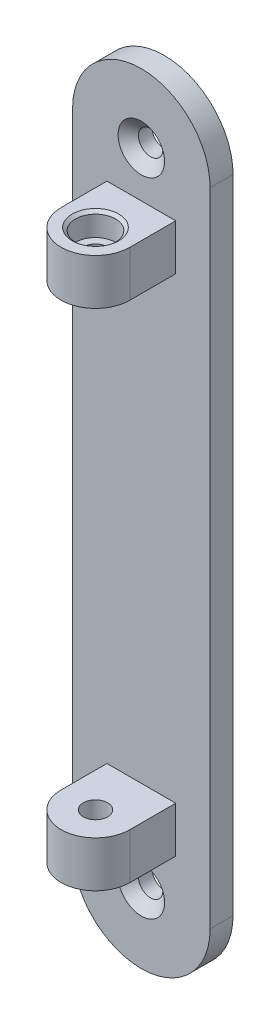
ISO-10303-21;
HEADER;
FILE_DESCRIPTION(('STEP AP214'),'2;1');
FILE_NAME('part.step','',(''),(''),'','','');
FILE_SCHEMA(('AUTOMOTIVE_DESIGN { 1 0 10303 214 1 1 1 1 }'));
ENDSEC;
DATA;
#1=APPLICATION_CONTEXT('core data for automotive mechanical design processes');
#2=APPLICATION_PROTOCOL_DEFINITION('international standard','automotive_design',2000,#1);
#3=PRODUCT_CONTEXT('',#1,'mechanical');
#4=PRODUCT('Part','Part','',(#3));
#5=PRODUCT_RELATED_PRODUCT_CATEGORY('part','',(#4));
#6=PRODUCT_DEFINITION_FORMATION('','',#4);
#7=PRODUCT_DEFINITION_CONTEXT('part definition',#1,'design');
#8=PRODUCT_DEFINITION('design','',#6,#7);
#9=PRODUCT_DEFINITION_SHAPE('','',#8);
#10=(LENGTH_UNIT() NAMED_UNIT(*) SI_UNIT(.MILLI.,.METRE.));
#11=(NAMED_UNIT(*) PLANE_ANGLE_UNIT() SI_UNIT($,.RADIAN.));
#12=(NAMED_UNIT(*) SI_UNIT($,.STERADIAN.) SOLID_ANGLE_UNIT());
#13=UNCERTAINTY_MEASURE_WITH_UNIT(LENGTH_MEASURE(1.E-05),#10,'distance_accuracy_value','');
#14=(GEOMETRIC_REPRESENTATION_CONTEXT(3) GLOBAL_UNCERTAINTY_ASSIGNED_CONTEXT((#13)) GLOBAL_UNIT_ASSIGNED_CONTEXT((#10,
#11,#12)) REPRESENTATION_CONTEXT('',''));
#15=CARTESIAN_POINT('',(0.,0.,0.));
#16=DIRECTION('',(0.,0.,1.));
#17=DIRECTION('',(1.,0.,0.));
#18=AXIS2_PLACEMENT_3D('',#15,#16,#17);
#19=CARTESIAN_POINT('',(9.525,-76.2,19.05));
#20=DIRECTION('',(0.,1.,0.));
#21=DIRECTION('',(0.,0.,1.));
#22=AXIS2_PLACEMENT_3D('',#19,#20,#21);
#23=PLANE('',#22);
#24=DIRECTION('',(1.,0.,0.));
#25=VECTOR('',#24,1.);
#26=CARTESIAN_POINT('',(9.525,-76.2,6.35));
#27=LINE('',#26,#25);
#28=CARTESIAN_POINT('',(9.525,-76.2,6.35));
#29=VERTEX_POINT('',#28);
#30=CARTESIAN_POINT('',(28.575,-76.2,6.35));
#31=VERTEX_POINT('',#30);
#32=EDGE_CURVE('E144',#29,#31,#27,.T.);
#33=ORIENTED_EDGE('',*,*,#32,.T.);
#34=DIRECTION('',(0.,0.,-1.));
#35=VECTOR('',#34,1.);
#36=CARTESIAN_POINT('',(28.575,-76.2,19.05));
#37=LINE('',#36,#35);
#38=CARTESIAN_POINT('',(28.575,-76.2,19.05));
#39=VERTEX_POINT('',#38);
#40=EDGE_CURVE('E56',#39,#31,#37,.T.);
#41=ORIENTED_EDGE('',*,*,#40,.F.);
#42=CARTESIAN_POINT('',(19.05,-76.2,19.05));
#43=DIRECTION('',(0.,-1.,0.));
#44=DIRECTION('',(0.,0.,-1.));
#45=AXIS2_PLACEMENT_3D('',#42,#43,#44);
#46=CIRCLE('',#45,9.525);
#47=CARTESIAN_POINT('',(9.525,-76.2,19.05));
#48=VERTEX_POINT('',#47);
#49=EDGE_CURVE('E131',#39,#48,#46,.T.);
#50=ORIENTED_EDGE('',*,*,#49,.T.);
#51=DIRECTION('',(0.,0.,-1.));
#52=VECTOR('',#51,1.);
#53=CARTESIAN_POINT('',(9.525,-76.2,19.05));
#54=LINE('',#53,#52);
#55=EDGE_CURVE('E147',#48,#29,#54,.T.);
#56=ORIENTED_EDGE('',*,*,#55,.T.);
#57=EDGE_LOOP('',(#33,#41,#50,#56));
#58=FACE_BOUND('',#57,.T.);
#59=CARTESIAN_POINT('',(19.05,-76.2,19.05));
#60=DIRECTION('',(0.,-1.,0.));
#61=DIRECTION('',(0.,0.,-1.));
#62=AXIS2_PLACEMENT_3D('',#59,#60,#61);
#63=CIRCLE('',#62,6.4389);
#64=CARTESIAN_POINT('',(19.05,-76.2,12.6111));
#65=VERTEX_POINT('',#64);
#66=EDGE_CURVE('E625',#65,#65,#63,.T.);
#67=ORIENTED_EDGE('',*,*,#66,.F.);
#68=EDGE_LOOP('',(#67));
#69=FACE_BOUND('',#68,.T.);
#70=ADVANCED_FACE('F39',(#58,#69),#23,.F.);
#71=CARTESIAN_POINT('',(9.525,63.5,19.05));
#72=DIRECTION('',(0.,1.,0.));
#73=DIRECTION('',(0.,0.,1.));
#74=AXIS2_PLACEMENT_3D('',#71,#72,#73);
#75=PLANE('',#74);
#76=DIRECTION('',(1.,0.,0.));
#77=VECTOR('',#76,1.);
#78=CARTESIAN_POINT('',(9.525,63.5,6.35));
#79=LINE('',#78,#77);
#80=CARTESIAN_POINT('',(9.525,63.5,6.35));
#81=VERTEX_POINT('',#80);
#82=CARTESIAN_POINT('',(28.575,63.5,6.35));
#83=VERTEX_POINT('',#82);
#84=EDGE_CURVE('E230',#81,#83,#79,.T.);
#85=ORIENTED_EDGE('',*,*,#84,.T.);
#86=DIRECTION('',(0.,0.,-1.));
#87=VECTOR('',#86,1.);
#88=CARTESIAN_POINT('',(28.575,63.5,19.05));
#89=LINE('',#88,#87);
#90=CARTESIAN_POINT('',(28.575,63.5,19.05));
#91=VERTEX_POINT('',#90);
#92=EDGE_CURVE('E263',#91,#83,#89,.T.);
#93=ORIENTED_EDGE('',*,*,#92,.F.);
#94=CARTESIAN_POINT('',(19.05,63.5,19.05));
#95=DIRECTION('',(0.,1.,0.));
#96=DIRECTION('',(0.,0.,1.));
#97=AXIS2_PLACEMENT_3D('',#94,#95,#96);
#98=CIRCLE('',#97,9.525);
#99=CARTESIAN_POINT('',(9.525,63.5,19.05));
#100=VERTEX_POINT('',#99);
#101=EDGE_CURVE('E226',#100,#91,#98,.T.);
#102=ORIENTED_EDGE('',*,*,#101,.F.);
#103=DIRECTION('',(0.,0.,-1.));
#104=VECTOR('',#103,1.);
#105=CARTESIAN_POINT('',(9.525,63.5,19.05));
#106=LINE('',#105,#104);
#107=EDGE_CURVE('E242',#100,#81,#106,.T.);
#108=ORIENTED_EDGE('',*,*,#107,.T.);
#109=EDGE_LOOP('',(#85,#93,#102,#108));
#110=FACE_BOUND('',#109,.T.);
#111=CARTESIAN_POINT('',(19.05,63.5,19.05));
#112=DIRECTION('',(0.,1.,0.));
#113=DIRECTION('',(0.,0.,1.));
#114=AXIS2_PLACEMENT_3D('',#111,#112,#113);
#115=CIRCLE('',#114,3.3782);
#116=CARTESIAN_POINT('',(19.05,63.5,22.4282));
#117=VERTEX_POINT('',#116);
#118=EDGE_CURVE('E206',#117,#117,#115,.F.);
#119=ORIENTED_EDGE('',*,*,#118,.F.);
#120=EDGE_LOOP('',(#119));
#121=FACE_BOUND('',#120,.T.);
#122=ADVANCED_FACE('F327',(#110,#121),#75,.F.);
#123=CARTESIAN_POINT('',(19.05,88.9,6.35));
#124=DIRECTION('',(0.,0.,1.));
#125=DIRECTION('',(1.,0.,0.));
#126=AXIS2_PLACEMENT_3D('',#123,#124,#125);
#127=PLANE('',#126);
#128=DIRECTION('',(1.,0.,0.));
#129=VECTOR('',#128,1.);
#130=CARTESIAN_POINT('',(9.525,-63.5,6.35));
#131=LINE('',#130,#129);
#132=CARTESIAN_POINT('',(9.525,-63.5,6.35));
#133=VERTEX_POINT('',#132);
#134=CARTESIAN_POINT('',(28.575,-63.5,6.35));
#135=VERTEX_POINT('',#134);
#136=EDGE_CURVE('E160',#133,#135,#131,.T.);
#137=ORIENTED_EDGE('',*,*,#136,.T.);
#138=DIRECTION('',(0.,1.,0.));
#139=VECTOR('',#138,1.);
#140=CARTESIAN_POINT('',(28.575,-76.2,6.35));
#141=LINE('',#140,#139);
#142=EDGE_CURVE('E157',#31,#135,#141,.T.);
#143=ORIENTED_EDGE('',*,*,#142,.F.);
#144=ORIENTED_EDGE('',*,*,#32,.F.);
#145=DIRECTION('',(0.,1.,0.));
#146=VECTOR('',#145,1.);
#147=CARTESIAN_POINT('',(9.525,-76.2,6.35));
#148=LINE('',#147,#146);
#149=EDGE_CURVE('E164',#29,#133,#148,.T.);
#150=ORIENTED_EDGE('',*,*,#149,.T.);
#151=EDGE_LOOP('',(#137,#143,#144,#150));
#152=FACE_BOUND('',#151,.T.);
#153=CARTESIAN_POINT('',(19.05,-88.9,6.35));
#154=DIRECTION('',(0.,0.,1.));
#155=DIRECTION('',(1.,0.,0.));
#156=AXIS2_PLACEMENT_3D('',#153,#154,#155);
#157=CIRCLE('',#156,6.4389);
#158=CARTESIAN_POINT('',(25.4889,-88.9,6.35));
#159=VERTEX_POINT('',#158);
#160=EDGE_CURVE('E177',#159,#159,#157,.T.);
#161=ORIENTED_EDGE('',*,*,#160,.F.);
#162=EDGE_LOOP('',(#161));
#163=FACE_BOUND('',#162,.T.);
#164=CARTESIAN_POINT('',(19.05,88.9,6.35));
#165=DIRECTION('',(0.,0.,1.));
#166=DIRECTION('',(1.,0.,0.));
#167=AXIS2_PLACEMENT_3D('',#164,#165,#166);
#168=CIRCLE('',#167,6.4389);
#169=CARTESIAN_POINT('',(25.4889,88.9,6.35));
#170=VERTEX_POINT('',#169);
#171=EDGE_CURVE('E266',#170,#170,#168,.T.);
#172=ORIENTED_EDGE('',*,*,#171,.F.);
#173=EDGE_LOOP('',(#172));
#174=FACE_BOUND('',#173,.T.);
#175=DIRECTION('',(0.,-1.,0.));
#176=VECTOR('',#175,1.);
#177=CARTESIAN_POINT('',(0.,88.9,6.35));
#178=LINE('',#177,#176);
#179=CARTESIAN_POINT('',(0.,88.9,6.35));
#180=VERTEX_POINT('',#179);
#181=CARTESIAN_POINT('',(0.,-88.9,6.35));
#182=VERTEX_POINT('',#181);
#183=EDGE_CURVE('E279',#180,#182,#178,.T.);
#184=ORIENTED_EDGE('',*,*,#183,.T.);
#185=CARTESIAN_POINT('',(19.05,-88.9,6.35));
#186=DIRECTION('',(0.,0.,-1.));
#187=DIRECTION('',(1.,0.,0.));
#188=AXIS2_PLACEMENT_3D('',#185,#186,#187);
#189=CIRCLE('',#188,19.05);
#190=CARTESIAN_POINT('',(38.1,-88.9,6.35));
#191=VERTEX_POINT('',#190);
#192=EDGE_CURVE('E190',#191,#182,#189,.T.);
#193=ORIENTED_EDGE('',*,*,#192,.F.);
#194=DIRECTION('',(0.,1.,0.));
#195=VECTOR('',#194,1.);
#196=CARTESIAN_POINT('',(38.1,0.,6.35));
#197=LINE('',#196,#195);
#198=CARTESIAN_POINT('',(38.1,88.9,6.35));
#199=VERTEX_POINT('',#198);
#200=EDGE_CURVE('E282',#191,#199,#197,.T.);
#201=ORIENTED_EDGE('',*,*,#200,.T.);
#202=CARTESIAN_POINT('',(19.05,88.9,6.35));
#203=DIRECTION('',(0.,0.,1.));
#204=DIRECTION('',(1.,0.,0.));
#205=AXIS2_PLACEMENT_3D('',#202,#203,#204);
#206=CIRCLE('',#205,19.05);
#207=EDGE_CURVE('E286',#199,#180,#206,.T.);
#208=ORIENTED_EDGE('',*,*,#207,.T.);
#209=EDGE_LOOP('',(#184,#193,#201,#208));
#210=FACE_BOUND('',#209,.T.);
#211=DIRECTION('',(0.,-1.,0.));
#212=VECTOR('',#211,1.);
#213=CARTESIAN_POINT('',(28.575,76.2,6.35));
#214=LINE('',#213,#212);
#215=CARTESIAN_POINT('',(28.575,76.2,6.35));
#216=VERTEX_POINT('',#215);
#217=EDGE_CURVE('E246',#216,#83,#214,.T.);
#218=ORIENTED_EDGE('',*,*,#217,.T.);
#219=ORIENTED_EDGE('',*,*,#84,.F.);
#220=DIRECTION('',(0.,-1.,0.));
#221=VECTOR('',#220,1.);
#222=CARTESIAN_POINT('',(9.525,76.2,6.35));
#223=LINE('',#222,#221);
#224=CARTESIAN_POINT('',(9.525,76.2,6.35));
#225=VERTEX_POINT('',#224);
#226=EDGE_CURVE('E238',#225,#81,#223,.T.);
#227=ORIENTED_EDGE('',*,*,#226,.F.);
#228=DIRECTION('',(1.,0.,0.));
#229=VECTOR('',#228,1.);
#230=CARTESIAN_POINT('',(9.525,76.2,6.35));
#231=LINE('',#230,#229);
#232=EDGE_CURVE('E64',#225,#216,#231,.T.);
#233=ORIENTED_EDGE('',*,*,#232,.T.);
#234=EDGE_LOOP('',(#218,#219,#227,#233));
#235=FACE_BOUND('',#234,.T.);
#236=ADVANCED_FACE('F314',(#152,#163,#174,#210,#235),#127,.T.);
#237=CARTESIAN_POINT('',(0.,88.9,6.35));
#238=DIRECTION('',(1.,0.,0.));
#239=DIRECTION('',(0.,0.,-1.));
#240=AXIS2_PLACEMENT_3D('',#237,#238,#239);
#241=PLANE('',#240);
#242=DIRECTION('',(0.,-1.,0.));
#243=VECTOR('',#242,1.);
#244=CARTESIAN_POINT('',(0.,88.9,0.));
#245=LINE('',#244,#243);
#246=CARTESIAN_POINT('',(0.,88.9,0.));
#247=VERTEX_POINT('',#246);
#248=CARTESIAN_POINT('',(0.,-88.9,0.));
#249=VERTEX_POINT('',#248);
#250=EDGE_CURVE('E278',#247,#249,#245,.T.);
#251=ORIENTED_EDGE('',*,*,#250,.T.);
#252=DIRECTION('',(0.,0.,-1.));
#253=VECTOR('',#252,1.);
#254=CARTESIAN_POINT('',(0.,-88.9,6.35));
#255=LINE('',#254,#253);
#256=EDGE_CURVE('E201',#182,#249,#255,.T.);
#257=ORIENTED_EDGE('',*,*,#256,.F.);
#258=ORIENTED_EDGE('',*,*,#183,.F.);
#259=DIRECTION('',(0.,0.,-1.));
#260=VECTOR('',#259,1.);
#261=CARTESIAN_POINT('',(0.,88.9,6.35));
#262=LINE('',#261,#260);
#263=EDGE_CURVE('E49',#180,#247,#262,.T.);
#264=ORIENTED_EDGE('',*,*,#263,.T.);
#265=EDGE_LOOP('',(#251,#257,#258,#264));
#266=FACE_BOUND('',#265,.T.);
#267=ADVANCED_FACE('F41',(#266),#241,.F.);
#268=CARTESIAN_POINT('',(38.1,0.,6.35));
#269=DIRECTION('',(-1.,0.,0.));
#270=DIRECTION('',(0.,0.,1.));
#271=AXIS2_PLACEMENT_3D('',#268,#269,#270);
#272=PLANE('',#271);
#273=DIRECTION('',(0.,1.,0.));
#274=VECTOR('',#273,1.);
#275=CARTESIAN_POINT('',(38.1,0.,0.));
#276=LINE('',#275,#274);
#277=CARTESIAN_POINT('',(38.1,-88.9,0.));
#278=VERTEX_POINT('',#277);
#279=CARTESIAN_POINT('',(38.1,88.9,0.));
#280=VERTEX_POINT('',#279);
#281=EDGE_CURVE('E291',#278,#280,#276,.T.);
#282=ORIENTED_EDGE('',*,*,#281,.T.);
#283=DIRECTION('',(0.,0.,-1.));
#284=VECTOR('',#283,1.);
#285=CARTESIAN_POINT('',(38.1,88.9,6.35));
#286=LINE('',#285,#284);
#287=EDGE_CURVE('E11',#199,#280,#286,.T.);
#288=ORIENTED_EDGE('',*,*,#287,.F.);
#289=ORIENTED_EDGE('',*,*,#200,.F.);
#290=DIRECTION('',(0.,0.,-1.));
#291=VECTOR('',#290,1.);
#292=CARTESIAN_POINT('',(38.1,-88.9,6.35));
#293=LINE('',#292,#291);
#294=EDGE_CURVE('E194',#191,#278,#293,.T.);
#295=ORIENTED_EDGE('',*,*,#294,.T.);
#296=EDGE_LOOP('',(#282,#288,#289,#295));
#297=FACE_BOUND('',#296,.T.);
#298=ADVANCED_FACE('F319',(#297),#272,.F.);
#299=CARTESIAN_POINT('',(19.05,88.9,6.35));
#300=DIRECTION('',(0.,0.,-1.));
#301=DIRECTION('',(-1.,0.,0.));
#302=AXIS2_PLACEMENT_3D('',#299,#300,#301);
#303=CYLINDRICAL_SURFACE('',#302,19.05);
#304=CARTESIAN_POINT('',(19.05,88.9,0.));
#305=DIRECTION('',(0.,0.,1.));
#306=DIRECTION('',(1.,0.,0.));
#307=AXIS2_PLACEMENT_3D('',#304,#305,#306);
#308=CIRCLE('',#307,19.05);
#309=EDGE_CURVE('E283',#280,#247,#308,.T.);
#310=ORIENTED_EDGE('',*,*,#309,.T.);
#311=ORIENTED_EDGE('',*,*,#263,.F.);
#312=ORIENTED_EDGE('',*,*,#207,.F.);
#313=ORIENTED_EDGE('',*,*,#287,.T.);
#314=EDGE_LOOP('',(#310,#311,#312,#313));
#315=FACE_BOUND('',#314,.T.);
#316=ADVANCED_FACE('F317',(#315),#303,.T.);
#317=CARTESIAN_POINT('',(19.05,88.9,0.));
#318=DIRECTION('',(0.,0.,1.));
#319=DIRECTION('',(1.,0.,0.));
#320=AXIS2_PLACEMENT_3D('',#317,#318,#319);
#321=PLANE('',#320);
#322=CARTESIAN_POINT('',(19.05,-88.9,0.));
#323=DIRECTION('',(0.,0.,1.));
#324=DIRECTION('',(1.,0.,0.));
#325=AXIS2_PLACEMENT_3D('',#322,#323,#324);
#326=CIRCLE('',#325,3.3782);
#327=CARTESIAN_POINT('',(22.4282,-88.9,0.));
#328=VERTEX_POINT('',#327);
#329=EDGE_CURVE('E185',#328,#328,#326,.T.);
#330=ORIENTED_EDGE('',*,*,#329,.T.);
#331=EDGE_LOOP('',(#330));
#332=FACE_BOUND('',#331,.T.);
#333=CARTESIAN_POINT('',(19.05,88.9,0.));
#334=DIRECTION('',(0.,0.,1.));
#335=DIRECTION('',(1.,0.,0.));
#336=AXIS2_PLACEMENT_3D('',#333,#334,#335);
#337=CIRCLE('',#336,3.3782);
#338=CARTESIAN_POINT('',(22.4282,88.9,0.));
#339=VERTEX_POINT('',#338);
#340=EDGE_CURVE('E274',#339,#339,#337,.T.);
#341=ORIENTED_EDGE('',*,*,#340,.T.);
#342=EDGE_LOOP('',(#341));
#343=FACE_BOUND('',#342,.T.);
#344=ORIENTED_EDGE('',*,*,#250,.F.);
#345=ORIENTED_EDGE('',*,*,#309,.F.);
#346=ORIENTED_EDGE('',*,*,#281,.F.);
#347=CARTESIAN_POINT('',(19.05,-88.9,0.));
#348=DIRECTION('',(0.,0.,-1.));
#349=DIRECTION('',(1.,0.,0.));
#350=AXIS2_PLACEMENT_3D('',#347,#348,#349);
#351=CIRCLE('',#350,19.05);
#352=EDGE_CURVE('E189',#278,#249,#351,.T.);
#353=ORIENTED_EDGE('',*,*,#352,.T.);
#354=EDGE_LOOP('',(#344,#345,#346,#353));
#355=FACE_BOUND('',#354,.T.);
#356=ADVANCED_FACE('F307',(#332,#343,#355),#321,.F.);
#357=CARTESIAN_POINT('',(19.05,88.9,6.35));
#358=DIRECTION('',(0.,0.,1.));
#359=DIRECTION('',(1.,0.,0.));
#360=AXIS2_PLACEMENT_3D('',#357,#358,#359);
#361=CYLINDRICAL_SURFACE('',#360,3.3782);
#362=ORIENTED_EDGE('',*,*,#340,.F.);
#363=EDGE_LOOP('',(#362));
#364=FACE_BOUND('',#363,.T.);
#365=CARTESIAN_POINT('',(19.05,88.9,3.7817677588557));
#366=DIRECTION('',(0.,0.,1.));
#367=DIRECTION('',(1.,0.,0.));
#368=AXIS2_PLACEMENT_3D('',#365,#366,#367);
#369=CIRCLE('',#368,3.3782);
#370=CARTESIAN_POINT('',(22.4282,88.9,3.7817677588557));
#371=VERTEX_POINT('',#370);
#372=EDGE_CURVE('E270',#371,#371,#369,.T.);
#373=ORIENTED_EDGE('',*,*,#372,.T.);
#374=EDGE_LOOP('',(#373));
#375=FACE_BOUND('',#374,.T.);
#376=ADVANCED_FACE('F390',(#364,#375),#361,.F.);
#377=CARTESIAN_POINT('',(19.05,88.9,6.35));
#378=DIRECTION('',(0.,0.,1.));
#379=DIRECTION('',(1.,0.,0.));
#380=AXIS2_PLACEMENT_3D('',#377,#378,#379);
#381=CONICAL_SURFACE('',#380,6.4389,0.872664625997165);
#382=ORIENTED_EDGE('',*,*,#372,.F.);
#383=EDGE_LOOP('',(#382));
#384=FACE_BOUND('',#383,.T.);
#385=ORIENTED_EDGE('',*,*,#171,.T.);
#386=EDGE_LOOP('',(#385));
#387=FACE_BOUND('',#386,.T.);
#388=ADVANCED_FACE('F385',(#384,#387),#381,.F.);
#389=CARTESIAN_POINT('',(28.575,76.2,19.05));
#390=DIRECTION('',(1.,0.,0.));
#391=DIRECTION('',(0.,1.,0.));
#392=AXIS2_PLACEMENT_3D('',#389,#390,#391);
#393=PLANE('',#392);
#394=ORIENTED_EDGE('',*,*,#217,.F.);
#395=DIRECTION('',(0.,0.,-1.));
#396=VECTOR('',#395,1.);
#397=CARTESIAN_POINT('',(28.575,76.2,19.05));
#398=LINE('',#397,#396);
#399=CARTESIAN_POINT('',(28.575,76.2,19.05));
#400=VERTEX_POINT('',#399);
#401=EDGE_CURVE('E260',#400,#216,#398,.T.);
#402=ORIENTED_EDGE('',*,*,#401,.F.);
#403=DIRECTION('',(0.,-1.,0.));
#404=VECTOR('',#403,1.);
#405=CARTESIAN_POINT('',(28.575,76.2,19.05));
#406=LINE('',#405,#404);
#407=EDGE_CURVE('E234',#400,#91,#406,.T.);
#408=ORIENTED_EDGE('',*,*,#407,.T.);
#409=ORIENTED_EDGE('',*,*,#92,.T.);
#410=EDGE_LOOP('',(#394,#402,#408,#409));
#411=FACE_BOUND('',#410,.T.);
#412=ADVANCED_FACE('F382',(#411),#393,.T.);
#413=CARTESIAN_POINT('',(9.525,76.2,19.05));
#414=DIRECTION('',(0.,1.,0.));
#415=DIRECTION('',(0.,0.,1.));
#416=AXIS2_PLACEMENT_3D('',#413,#414,#415);
#417=PLANE('',#416);
#418=CARTESIAN_POINT('',(19.05,76.2,19.05));
#419=DIRECTION('',(0.,1.,0.));
#420=DIRECTION('',(0.,0.,1.));
#421=AXIS2_PLACEMENT_3D('',#418,#419,#420);
#422=CIRCLE('',#421,6.4389);
#423=CARTESIAN_POINT('',(19.05,76.2,25.4889));
#424=VERTEX_POINT('',#423);
#425=EDGE_CURVE('E205',#424,#424,#422,.T.);
#426=ORIENTED_EDGE('',*,*,#425,.F.);
#427=EDGE_LOOP('',(#426));
#428=FACE_BOUND('',#427,.T.);
#429=ORIENTED_EDGE('',*,*,#232,.F.);
#430=DIRECTION('',(0.,0.,-1.));
#431=VECTOR('',#430,1.);
#432=CARTESIAN_POINT('',(9.525,76.2,19.05));
#433=LINE('',#432,#431);
#434=CARTESIAN_POINT('',(9.525,76.2,19.05));
#435=VERTEX_POINT('',#434);
#436=EDGE_CURVE('E257',#435,#225,#433,.T.);
#437=ORIENTED_EDGE('',*,*,#436,.F.);
#438=CARTESIAN_POINT('',(19.05,76.2,19.05));
#439=DIRECTION('',(0.,-1.,0.));
#440=DIRECTION('',(0.,0.,-1.));
#441=AXIS2_PLACEMENT_3D('',#438,#439,#440);
#442=CIRCLE('',#441,9.525);
#443=EDGE_CURVE('E210',#400,#435,#442,.T.);
#444=ORIENTED_EDGE('',*,*,#443,.F.);
#445=ORIENTED_EDGE('',*,*,#401,.T.);
#446=EDGE_LOOP('',(#429,#437,#444,#445));
#447=FACE_BOUND('',#446,.T.);
#448=ADVANCED_FACE('F378',(#428,#447),#417,.T.);
#449=CARTESIAN_POINT('',(9.525,76.2,19.05));
#450=DIRECTION('',(1.,0.,0.));
#451=DIRECTION('',(0.,1.,0.));
#452=AXIS2_PLACEMENT_3D('',#449,#450,#451);
#453=PLANE('',#452);
#454=ORIENTED_EDGE('',*,*,#226,.T.);
#455=ORIENTED_EDGE('',*,*,#107,.F.);
#456=DIRECTION('',(0.,-1.,0.));
#457=VECTOR('',#456,1.);
#458=CARTESIAN_POINT('',(9.525,76.2,19.05));
#459=LINE('',#458,#457);
#460=EDGE_CURVE('E237',#435,#100,#459,.T.);
#461=ORIENTED_EDGE('',*,*,#460,.F.);
#462=ORIENTED_EDGE('',*,*,#436,.T.);
#463=EDGE_LOOP('',(#454,#455,#461,#462));
#464=FACE_BOUND('',#463,.T.);
#465=ADVANCED_FACE('F374',(#464),#453,.F.);
#466=CARTESIAN_POINT('',(19.05,42.2014525143145,19.05));
#467=DIRECTION('',(0.,1.,0.));
#468=DIRECTION('',(0.,0.,1.));
#469=AXIS2_PLACEMENT_3D('',#466,#467,#468);
#470=CYLINDRICAL_SURFACE('',#469,9.525);
#471=ORIENTED_EDGE('',*,*,#460,.T.);
#472=ORIENTED_EDGE('',*,*,#101,.T.);
#473=ORIENTED_EDGE('',*,*,#407,.F.);
#474=ORIENTED_EDGE('',*,*,#443,.T.);
#475=EDGE_LOOP('',(#471,#472,#473,#474));
#476=FACE_BOUND('',#475,.T.);
#477=ADVANCED_FACE('F370',(#476),#470,.T.);
#478=CARTESIAN_POINT('',(19.05,76.2,19.05));
#479=DIRECTION('',(0.,1.,0.));
#480=DIRECTION('',(0.,0.,1.));
#481=AXIS2_PLACEMENT_3D('',#478,#479,#480);
#482=CYLINDRICAL_SURFACE('',#481,3.3782);
#483=ORIENTED_EDGE('',*,*,#118,.T.);
#484=EDGE_LOOP('',(#483));
#485=FACE_BOUND('',#484,.T.);
#486=CARTESIAN_POINT('',(19.05,69.85,19.05));
#487=DIRECTION('',(0.,1.,0.));
#488=DIRECTION('',(0.,0.,1.));
#489=AXIS2_PLACEMENT_3D('',#486,#487,#488);
#490=CIRCLE('',#489,3.3782);
#491=CARTESIAN_POINT('',(19.05,69.85,22.4282));
#492=VERTEX_POINT('',#491);
#493=EDGE_CURVE('E211',#492,#492,#490,.T.);
#494=ORIENTED_EDGE('',*,*,#493,.T.);
#495=EDGE_LOOP('',(#494));
#496=FACE_BOUND('',#495,.T.);
#497=ADVANCED_FACE('F366',(#485,#496),#482,.F.);
#498=CARTESIAN_POINT('',(22.4282,69.85,19.05));
#499=DIRECTION('',(0.,-1.,0.));
#500=DIRECTION('',(0.,0.,-1.));
#501=AXIS2_PLACEMENT_3D('',#498,#499,#500);
#502=PLANE('',#501);
#503=ORIENTED_EDGE('',*,*,#493,.F.);
#504=EDGE_LOOP('',(#503));
#505=FACE_BOUND('',#504,.T.);
#506=CARTESIAN_POINT('',(19.05,69.85,19.05));
#507=DIRECTION('',(0.,1.,0.));
#508=DIRECTION('',(0.,0.,1.));
#509=AXIS2_PLACEMENT_3D('',#506,#507,#508);
#510=CIRCLE('',#509,5.55625);
#511=CARTESIAN_POINT('',(19.05,69.85,24.60625));
#512=VERTEX_POINT('',#511);
#513=EDGE_CURVE('E219',#512,#512,#510,.T.);
#514=ORIENTED_EDGE('',*,*,#513,.T.);
#515=EDGE_LOOP('',(#514));
#516=FACE_BOUND('',#515,.T.);
#517=ADVANCED_FACE('F362',(#505,#516),#502,.F.);
#518=CARTESIAN_POINT('',(19.05,76.2,19.05));
#519=DIRECTION('',(0.,1.,0.));
#520=DIRECTION('',(0.,0.,1.));
#521=AXIS2_PLACEMENT_3D('',#518,#519,#520);
#522=CYLINDRICAL_SURFACE('',#521,5.55625);
#523=ORIENTED_EDGE('',*,*,#513,.F.);
#524=EDGE_LOOP('',(#523));
#525=FACE_BOUND('',#524,.T.);
#526=CARTESIAN_POINT('',(19.05,75.4593687105414,19.05));
#527=DIRECTION('',(0.,1.,0.));
#528=DIRECTION('',(0.,0.,1.));
#529=AXIS2_PLACEMENT_3D('',#526,#527,#528);
#530=CIRCLE('',#529,5.55625);
#531=CARTESIAN_POINT('',(19.05,75.4593687105414,24.60625));
#532=VERTEX_POINT('',#531);
#533=EDGE_CURVE('E215',#532,#532,#530,.T.);
#534=ORIENTED_EDGE('',*,*,#533,.T.);
#535=EDGE_LOOP('',(#534));
#536=FACE_BOUND('',#535,.T.);
#537=ADVANCED_FACE('F358',(#525,#536),#522,.F.);
#538=CARTESIAN_POINT('',(19.05,76.2,19.05));
#539=DIRECTION('',(0.,1.,0.));
#540=DIRECTION('',(0.,0.,1.));
#541=AXIS2_PLACEMENT_3D('',#538,#539,#540);
#542=CONICAL_SURFACE('',#541,6.4389,0.872664625997164);
#543=ORIENTED_EDGE('',*,*,#533,.F.);
#544=EDGE_LOOP('',(#543));
#545=FACE_BOUND('',#544,.T.);
#546=ORIENTED_EDGE('',*,*,#425,.T.);
#547=EDGE_LOOP('',(#546));
#548=FACE_BOUND('',#547,.T.);
#549=ADVANCED_FACE('F355',(#545,#548),#542,.F.);
#550=CARTESIAN_POINT('',(19.05,-88.9,6.35));
#551=DIRECTION('',(0.,0.,-1.));
#552=DIRECTION('',(-1.,0.,0.));
#553=AXIS2_PLACEMENT_3D('',#550,#551,#552);
#554=CYLINDRICAL_SURFACE('',#553,19.05);
#555=ORIENTED_EDGE('',*,*,#352,.F.);
#556=ORIENTED_EDGE('',*,*,#294,.F.);
#557=ORIENTED_EDGE('',*,*,#192,.T.);
#558=ORIENTED_EDGE('',*,*,#256,.T.);
#559=EDGE_LOOP('',(#555,#556,#557,#558));
#560=FACE_BOUND('',#559,.T.);
#561=ADVANCED_FACE('F311',(#560),#554,.T.);
#562=CARTESIAN_POINT('',(19.05,-88.9,6.35));
#563=DIRECTION('',(0.,0.,1.));
#564=DIRECTION('',(1.,0.,0.));
#565=AXIS2_PLACEMENT_3D('',#562,#563,#564);
#566=CYLINDRICAL_SURFACE('',#565,3.3782);
#567=ORIENTED_EDGE('',*,*,#329,.F.);
#568=EDGE_LOOP('',(#567));
#569=FACE_BOUND('',#568,.T.);
#570=CARTESIAN_POINT('',(19.05,-88.9,3.7817677588557));
#571=DIRECTION('',(0.,0.,1.));
#572=DIRECTION('',(1.,0.,0.));
#573=AXIS2_PLACEMENT_3D('',#570,#571,#572);
#574=CIRCLE('',#573,3.3782);
#575=CARTESIAN_POINT('',(22.4282,-88.9,3.7817677588557));
#576=VERTEX_POINT('',#575);
#577=EDGE_CURVE('E181',#576,#576,#574,.T.);
#578=ORIENTED_EDGE('',*,*,#577,.T.);
#579=EDGE_LOOP('',(#578));
#580=FACE_BOUND('',#579,.T.);
#581=ADVANCED_FACE('F348',(#569,#580),#566,.F.);
#582=CARTESIAN_POINT('',(19.05,-88.9,6.35));
#583=DIRECTION('',(0.,0.,1.));
#584=DIRECTION('',(1.,0.,0.));
#585=AXIS2_PLACEMENT_3D('',#582,#583,#584);
#586=CONICAL_SURFACE('',#585,6.4389,0.872664625997165);
#587=ORIENTED_EDGE('',*,*,#577,.F.);
#588=EDGE_LOOP('',(#587));
#589=FACE_BOUND('',#588,.T.);
#590=ORIENTED_EDGE('',*,*,#160,.T.);
#591=EDGE_LOOP('',(#590));
#592=FACE_BOUND('',#591,.T.);
#593=ADVANCED_FACE('F344',(#589,#592),#586,.F.);
#594=CARTESIAN_POINT('',(9.525,-63.5,19.05));
#595=DIRECTION('',(0.,1.,0.));
#596=DIRECTION('',(0.,0.,1.));
#597=AXIS2_PLACEMENT_3D('',#594,#595,#596);
#598=PLANE('',#597);
#599=CARTESIAN_POINT('',(19.05,-63.5,19.05));
#600=DIRECTION('',(0.,1.,0.));
#601=DIRECTION('',(0.,0.,1.));
#602=AXIS2_PLACEMENT_3D('',#599,#600,#601);
#603=CIRCLE('',#602,3.37819999999998);
#604=CARTESIAN_POINT('',(19.05,-63.5,22.4282));
#605=VERTEX_POINT('',#604);
#606=EDGE_CURVE('E43',#605,#605,#603,.T.);
#607=ORIENTED_EDGE('',*,*,#606,.F.);
#608=EDGE_LOOP('',(#607));
#609=FACE_BOUND('',#608,.T.);
#610=ORIENTED_EDGE('',*,*,#136,.F.);
#611=DIRECTION('',(0.,0.,-1.));
#612=VECTOR('',#611,1.);
#613=CARTESIAN_POINT('',(9.525,-63.5,19.05));
#614=LINE('',#613,#612);
#615=CARTESIAN_POINT('',(9.525,-63.5,19.05));
#616=VERTEX_POINT('',#615);
#617=EDGE_CURVE('E174',#616,#133,#614,.T.);
#618=ORIENTED_EDGE('',*,*,#617,.F.);
#619=CARTESIAN_POINT('',(19.05,-63.5,19.05));
#620=DIRECTION('',(0.,-1.,0.));
#621=DIRECTION('',(0.,0.,-1.));
#622=AXIS2_PLACEMENT_3D('',#619,#620,#621);
#623=CIRCLE('',#622,9.525);
#624=CARTESIAN_POINT('',(28.575,-63.5,19.05));
#625=VERTEX_POINT('',#624);
#626=EDGE_CURVE('E140',#616,#625,#623,.F.);
#627=ORIENTED_EDGE('',*,*,#626,.T.);
#628=DIRECTION('',(0.,0.,-1.));
#629=VECTOR('',#628,1.);
#630=CARTESIAN_POINT('',(28.575,-63.5,19.05));
#631=LINE('',#630,#629);
#632=EDGE_CURVE('E148',#625,#135,#631,.T.);
#633=ORIENTED_EDGE('',*,*,#632,.T.);
#634=EDGE_LOOP('',(#610,#618,#627,#633));
#635=FACE_BOUND('',#634,.T.);
#636=ADVANCED_FACE('F340',(#609,#635),#598,.T.);
#637=CARTESIAN_POINT('',(9.525,-76.2,19.05));
#638=DIRECTION('',(-1.,0.,0.));
#639=DIRECTION('',(0.,-1.,0.));
#640=AXIS2_PLACEMENT_3D('',#637,#638,#639);
#641=PLANE('',#640);
#642=ORIENTED_EDGE('',*,*,#149,.F.);
#643=ORIENTED_EDGE('',*,*,#55,.F.);
#644=DIRECTION('',(0.,1.,0.));
#645=VECTOR('',#644,1.);
#646=CARTESIAN_POINT('',(9.525,-76.2,19.05));
#647=LINE('',#646,#645);
#648=EDGE_CURVE('E136',#48,#616,#647,.T.);
#649=ORIENTED_EDGE('',*,*,#648,.T.);
#650=ORIENTED_EDGE('',*,*,#617,.T.);
#651=EDGE_LOOP('',(#642,#643,#649,#650));
#652=FACE_BOUND('',#651,.T.);
#653=ADVANCED_FACE('F337',(#652),#641,.T.);
#654=CARTESIAN_POINT('',(28.575,-76.2,19.05));
#655=DIRECTION('',(-1.,0.,0.));
#656=DIRECTION('',(0.,-1.,0.));
#657=AXIS2_PLACEMENT_3D('',#654,#655,#656);
#658=PLANE('',#657);
#659=ORIENTED_EDGE('',*,*,#142,.T.);
#660=ORIENTED_EDGE('',*,*,#632,.F.);
#661=DIRECTION('',(0.,1.,0.));
#662=VECTOR('',#661,1.);
#663=CARTESIAN_POINT('',(28.575,-76.2,19.05));
#664=LINE('',#663,#662);
#665=EDGE_CURVE('E133',#39,#625,#664,.T.);
#666=ORIENTED_EDGE('',*,*,#665,.F.);
#667=ORIENTED_EDGE('',*,*,#40,.T.);
#668=EDGE_LOOP('',(#659,#660,#666,#667));
#669=FACE_BOUND('',#668,.T.);
#670=ADVANCED_FACE('F151',(#669),#658,.F.);
#671=CARTESIAN_POINT('',(19.05,84.7985474856855,19.05));
#672=DIRECTION('',(0.,-1.,0.));
#673=DIRECTION('',(0.,0.,-1.));
#674=AXIS2_PLACEMENT_3D('',#671,#672,#673);
#675=CYLINDRICAL_SURFACE('',#674,9.525);
#676=ORIENTED_EDGE('',*,*,#626,.F.);
#677=ORIENTED_EDGE('',*,*,#648,.F.);
#678=ORIENTED_EDGE('',*,*,#49,.F.);
#679=ORIENTED_EDGE('',*,*,#665,.T.);
#680=EDGE_LOOP('',(#676,#677,#678,#679));
#681=FACE_BOUND('',#680,.T.);
#682=ADVANCED_FACE('F132',(#681),#675,.T.);
#683=CARTESIAN_POINT('',(19.05,-76.2,19.05));
#684=DIRECTION('',(0.,-1.,0.));
#685=DIRECTION('',(0.,0.,-1.));
#686=AXIS2_PLACEMENT_3D('',#683,#684,#685);
#687=CYLINDRICAL_SURFACE('',#686,3.37819999999998);
#688=ORIENTED_EDGE('',*,*,#606,.T.);
#689=EDGE_LOOP('',(#688));
#690=FACE_BOUND('',#689,.T.);
#691=CARTESIAN_POINT('',(19.05,-69.85,19.05));
#692=DIRECTION('',(0.,-1.,0.));
#693=DIRECTION('',(0.,0.,-1.));
#694=AXIS2_PLACEMENT_3D('',#691,#692,#693);
#695=CIRCLE('',#694,3.3782);
#696=CARTESIAN_POINT('',(19.05,-69.85,15.6718));
#697=VERTEX_POINT('',#696);
#698=EDGE_CURVE('E627',#697,#697,#695,.T.);
#699=ORIENTED_EDGE('',*,*,#698,.T.);
#700=EDGE_LOOP('',(#699));
#701=FACE_BOUND('',#700,.T.);
#702=ADVANCED_FACE('F489',(#690,#701),#687,.F.);
#703=CARTESIAN_POINT('',(22.4282,-69.85,19.05));
#704=DIRECTION('',(0.,1.,0.));
#705=DIRECTION('',(0.,0.,1.));
#706=AXIS2_PLACEMENT_3D('',#703,#704,#705);
#707=PLANE('',#706);
#708=ORIENTED_EDGE('',*,*,#698,.F.);
#709=EDGE_LOOP('',(#708));
#710=FACE_BOUND('',#709,.T.);
#711=CARTESIAN_POINT('',(19.05,-69.85,19.05));
#712=DIRECTION('',(0.,-1.,0.));
#713=DIRECTION('',(0.,0.,-1.));
#714=AXIS2_PLACEMENT_3D('',#711,#712,#713);
#715=CIRCLE('',#714,5.55625);
#716=CARTESIAN_POINT('',(19.05,-69.85,13.49375));
#717=VERTEX_POINT('',#716);
#718=EDGE_CURVE('E631',#717,#717,#715,.T.);
#719=ORIENTED_EDGE('',*,*,#718,.T.);
#720=EDGE_LOOP('',(#719));
#721=FACE_BOUND('',#720,.T.);
#722=ADVANCED_FACE('F495',(#710,#721),#707,.F.);
#723=CARTESIAN_POINT('',(19.05,-76.2,19.05));
#724=DIRECTION('',(0.,-1.,0.));
#725=DIRECTION('',(0.,0.,-1.));
#726=AXIS2_PLACEMENT_3D('',#723,#724,#725);
#727=CYLINDRICAL_SURFACE('',#726,5.55625);
#728=ORIENTED_EDGE('',*,*,#718,.F.);
#729=EDGE_LOOP('',(#728));
#730=FACE_BOUND('',#729,.T.);
#731=CARTESIAN_POINT('',(19.05,-75.4593687105414,19.05));
#732=DIRECTION('',(0.,-1.,0.));
#733=DIRECTION('',(0.,0.,-1.));
#734=AXIS2_PLACEMENT_3D('',#731,#732,#733);
#735=CIRCLE('',#734,5.55625);
#736=CARTESIAN_POINT('',(19.05,-75.4593687105414,13.49375));
#737=VERTEX_POINT('',#736);
#738=EDGE_CURVE('E622',#737,#737,#735,.T.);
#739=ORIENTED_EDGE('',*,*,#738,.T.);
#740=EDGE_LOOP('',(#739));
#741=FACE_BOUND('',#740,.T.);
#742=ADVANCED_FACE('F503',(#730,#741),#727,.F.);
#743=CARTESIAN_POINT('',(19.05,-76.2,19.05));
#744=DIRECTION('',(0.,-1.,0.));
#745=DIRECTION('',(0.,0.,-1.));
#746=AXIS2_PLACEMENT_3D('',#743,#744,#745);
#747=CONICAL_SURFACE('',#746,6.4389,0.872664625997164);
#748=ORIENTED_EDGE('',*,*,#738,.F.);
#749=EDGE_LOOP('',(#748));
#750=FACE_BOUND('',#749,.T.);
#751=ORIENTED_EDGE('',*,*,#66,.T.);
#752=EDGE_LOOP('',(#751));
#753=FACE_BOUND('',#752,.T.);
#754=ADVANCED_FACE('F511',(#750,#753),#747,.F.);
#755=CLOSED_SHELL('',(#70,#122,#236,#267,#298,#316,#356,#376,#388,#412,#448,#465,#477,#497,#517,
#537,#549,#561,#581,#593,#636,#653,#670,#682,#702,#722,#742,#754));
#756=MANIFOLD_SOLID_BREP('B2',#755);
#757=ADVANCED_BREP_SHAPE_REPRESENTATION('',(#18,#756),#14);
#758=SHAPE_DEFINITION_REPRESENTATION(#9,#757);
ENDSEC;
END-ISO-10303-21;
